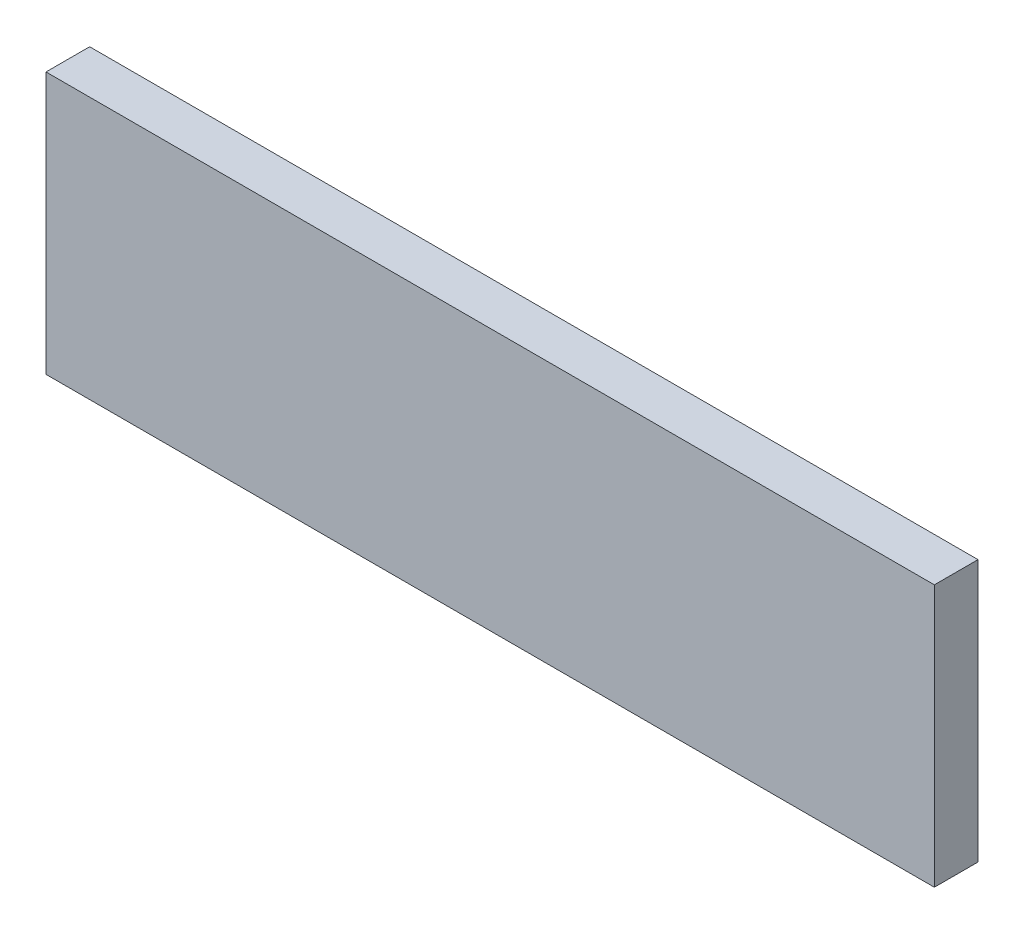
ISO-10303-21;
HEADER;
FILE_DESCRIPTION(('STEP AP214'),'2;1');
FILE_NAME('part.step','',(''),(''),'','','');
FILE_SCHEMA(('AUTOMOTIVE_DESIGN { 1 0 10303 214 1 1 1 1 }'));
ENDSEC;
DATA;
#1=APPLICATION_CONTEXT('core data for automotive mechanical design processes');
#2=APPLICATION_PROTOCOL_DEFINITION('international standard','automotive_design',2000,#1);
#3=PRODUCT_CONTEXT('',#1,'mechanical');
#4=PRODUCT('Part','Part','',(#3));
#5=PRODUCT_RELATED_PRODUCT_CATEGORY('part','',(#4));
#6=PRODUCT_DEFINITION_FORMATION('','',#4);
#7=PRODUCT_DEFINITION_CONTEXT('part definition',#1,'design');
#8=PRODUCT_DEFINITION('design','',#6,#7);
#9=PRODUCT_DEFINITION_SHAPE('','',#8);
#10=(LENGTH_UNIT() NAMED_UNIT(*) SI_UNIT(.MILLI.,.METRE.));
#11=(NAMED_UNIT(*) PLANE_ANGLE_UNIT() SI_UNIT($,.RADIAN.));
#12=(NAMED_UNIT(*) SI_UNIT($,.STERADIAN.) SOLID_ANGLE_UNIT());
#13=UNCERTAINTY_MEASURE_WITH_UNIT(LENGTH_MEASURE(1.E-05),#10,'distance_accuracy_value','');
#14=(GEOMETRIC_REPRESENTATION_CONTEXT(3) GLOBAL_UNCERTAINTY_ASSIGNED_CONTEXT((#13)) GLOBAL_UNIT_ASSIGNED_CONTEXT((#10,
#11,#12)) REPRESENTATION_CONTEXT('',''));
#15=CARTESIAN_POINT('',(0.,0.,0.));
#16=DIRECTION('',(0.,0.,1.));
#17=DIRECTION('',(1.,0.,0.));
#18=AXIS2_PLACEMENT_3D('',#15,#16,#17);
#19=CARTESIAN_POINT('',(203.5,-60.,20.));
#20=DIRECTION('',(-1.,0.,0.));
#21=DIRECTION('',(0.,0.,1.));
#22=AXIS2_PLACEMENT_3D('',#19,#20,#21);
#23=PLANE('',#22);
#24=DIRECTION('',(0.,1.,0.));
#25=VECTOR('',#24,1.);
#26=CARTESIAN_POINT('',(203.5,-60.,0.));
#27=LINE('',#26,#25);
#28=CARTESIAN_POINT('',(203.5,-60.,0.));
#29=VERTEX_POINT('',#28);
#30=CARTESIAN_POINT('',(203.5,60.,0.));
#31=VERTEX_POINT('',#30);
#32=EDGE_CURVE('E107',#29,#31,#27,.T.);
#33=ORIENTED_EDGE('',*,*,#32,.T.);
#34=DIRECTION('',(0.,0.,-1.));
#35=VECTOR('',#34,1.);
#36=CARTESIAN_POINT('',(203.5,60.,20.));
#37=LINE('',#36,#35);
#38=CARTESIAN_POINT('',(203.5,60.,20.));
#39=VERTEX_POINT('',#38);
#40=EDGE_CURVE('E11',#39,#31,#37,.T.);
#41=ORIENTED_EDGE('',*,*,#40,.F.);
#42=DIRECTION('',(0.,1.,0.));
#43=VECTOR('',#42,1.);
#44=CARTESIAN_POINT('',(203.5,-60.,20.));
#45=LINE('',#44,#43);
#46=CARTESIAN_POINT('',(203.5,-60.,20.));
#47=VERTEX_POINT('',#46);
#48=EDGE_CURVE('E91',#47,#39,#45,.T.);
#49=ORIENTED_EDGE('',*,*,#48,.F.);
#50=DIRECTION('',(0.,0.,-1.));
#51=VECTOR('',#50,1.);
#52=CARTESIAN_POINT('',(203.5,-60.,20.));
#53=LINE('',#52,#51);
#54=EDGE_CURVE('E103',#47,#29,#53,.T.);
#55=ORIENTED_EDGE('',*,*,#54,.T.);
#56=EDGE_LOOP('',(#33,#41,#49,#55));
#57=FACE_BOUND('',#56,.T.);
#58=ADVANCED_FACE('F39',(#57),#23,.F.);
#59=CARTESIAN_POINT('',(-203.5,60.,20.));
#60=DIRECTION('',(0.,-1.,0.));
#61=DIRECTION('',(0.,0.,-1.));
#62=AXIS2_PLACEMENT_3D('',#59,#60,#61);
#63=PLANE('',#62);
#64=DIRECTION('',(-1.,0.,0.));
#65=VECTOR('',#64,1.);
#66=CARTESIAN_POINT('',(-203.5,60.,0.));
#67=LINE('',#66,#65);
#68=CARTESIAN_POINT('',(-203.5,60.,0.));
#69=VERTEX_POINT('',#68);
#70=EDGE_CURVE('E96',#31,#69,#67,.T.);
#71=ORIENTED_EDGE('',*,*,#70,.T.);
#72=DIRECTION('',(0.,0.,-1.));
#73=VECTOR('',#72,1.);
#74=CARTESIAN_POINT('',(-203.5,60.,20.));
#75=LINE('',#74,#73);
#76=CARTESIAN_POINT('',(-203.5,60.,20.));
#77=VERTEX_POINT('',#76);
#78=EDGE_CURVE('E48',#77,#69,#75,.T.);
#79=ORIENTED_EDGE('',*,*,#78,.F.);
#80=DIRECTION('',(-1.,0.,0.));
#81=VECTOR('',#80,1.);
#82=CARTESIAN_POINT('',(-203.5,60.,20.));
#83=LINE('',#82,#81);
#84=EDGE_CURVE('E86',#39,#77,#83,.T.);
#85=ORIENTED_EDGE('',*,*,#84,.F.);
#86=ORIENTED_EDGE('',*,*,#40,.T.);
#87=EDGE_LOOP('',(#71,#79,#85,#86));
#88=FACE_BOUND('',#87,.T.);
#89=ADVANCED_FACE('F95',(#88),#63,.F.);
#90=CARTESIAN_POINT('',(-203.5,-60.,20.));
#91=DIRECTION('',(1.,0.,0.));
#92=DIRECTION('',(0.,0.,-1.));
#93=AXIS2_PLACEMENT_3D('',#90,#91,#92);
#94=PLANE('',#93);
#95=DIRECTION('',(0.,-1.,0.));
#96=VECTOR('',#95,1.);
#97=CARTESIAN_POINT('',(-203.5,-60.,0.));
#98=LINE('',#97,#96);
#99=CARTESIAN_POINT('',(-203.5,-60.,0.));
#100=VERTEX_POINT('',#99);
#101=EDGE_CURVE('E73',#69,#100,#98,.T.);
#102=ORIENTED_EDGE('',*,*,#101,.T.);
#103=DIRECTION('',(0.,0.,-1.));
#104=VECTOR('',#103,1.);
#105=CARTESIAN_POINT('',(-203.5,-60.,20.));
#106=LINE('',#105,#104);
#107=CARTESIAN_POINT('',(-203.5,-60.,20.));
#108=VERTEX_POINT('',#107);
#109=EDGE_CURVE('E98',#108,#100,#106,.T.);
#110=ORIENTED_EDGE('',*,*,#109,.F.);
#111=DIRECTION('',(0.,-1.,0.));
#112=VECTOR('',#111,1.);
#113=CARTESIAN_POINT('',(-203.5,-60.,20.));
#114=LINE('',#113,#112);
#115=EDGE_CURVE('E89',#77,#108,#114,.T.);
#116=ORIENTED_EDGE('',*,*,#115,.F.);
#117=ORIENTED_EDGE('',*,*,#78,.T.);
#118=EDGE_LOOP('',(#102,#110,#116,#117));
#119=FACE_BOUND('',#118,.T.);
#120=ADVANCED_FACE('F99',(#119),#94,.F.);
#121=CARTESIAN_POINT('',(-203.5,-60.,20.));
#122=DIRECTION('',(0.,1.,0.));
#123=DIRECTION('',(0.,0.,1.));
#124=AXIS2_PLACEMENT_3D('',#121,#122,#123);
#125=PLANE('',#124);
#126=DIRECTION('',(1.,0.,0.));
#127=VECTOR('',#126,1.);
#128=CARTESIAN_POINT('',(-203.5,-60.,0.));
#129=LINE('',#128,#127);
#130=EDGE_CURVE('E79',#100,#29,#129,.T.);
#131=ORIENTED_EDGE('',*,*,#130,.T.);
#132=ORIENTED_EDGE('',*,*,#54,.F.);
#133=DIRECTION('',(1.,0.,0.));
#134=VECTOR('',#133,1.);
#135=CARTESIAN_POINT('',(-203.5,-60.,20.));
#136=LINE('',#135,#134);
#137=EDGE_CURVE('E56',#108,#47,#136,.T.);
#138=ORIENTED_EDGE('',*,*,#137,.F.);
#139=ORIENTED_EDGE('',*,*,#109,.T.);
#140=EDGE_LOOP('',(#131,#132,#138,#139));
#141=FACE_BOUND('',#140,.T.);
#142=ADVANCED_FACE('F120',(#141),#125,.F.);
#143=CARTESIAN_POINT('',(0.,0.,20.));
#144=DIRECTION('',(0.,0.,-1.));
#145=DIRECTION('',(-1.,0.,0.));
#146=AXIS2_PLACEMENT_3D('',#143,#144,#145);
#147=PLANE('',#146);
#148=ORIENTED_EDGE('',*,*,#48,.T.);
#149=ORIENTED_EDGE('',*,*,#84,.T.);
#150=ORIENTED_EDGE('',*,*,#115,.T.);
#151=ORIENTED_EDGE('',*,*,#137,.T.);
#152=EDGE_LOOP('',(#148,#149,#150,#151));
#153=FACE_BOUND('',#152,.T.);
#154=ADVANCED_FACE('F87',(#153),#147,.F.);
#155=CARTESIAN_POINT('',(0.,0.,0.));
#156=DIRECTION('',(0.,0.,-1.));
#157=DIRECTION('',(-1.,0.,0.));
#158=AXIS2_PLACEMENT_3D('',#155,#156,#157);
#159=PLANE('',#158);
#160=ORIENTED_EDGE('',*,*,#32,.F.);
#161=ORIENTED_EDGE('',*,*,#130,.F.);
#162=ORIENTED_EDGE('',*,*,#101,.F.);
#163=ORIENTED_EDGE('',*,*,#70,.F.);
#164=EDGE_LOOP('',(#160,#161,#162,#163));
#165=FACE_BOUND('',#164,.T.);
#166=ADVANCED_FACE('F123',(#165),#159,.T.);
#167=CLOSED_SHELL('',(#58,#89,#120,#142,#154,#166));
#168=MANIFOLD_SOLID_BREP('B2',#167);
#169=ADVANCED_BREP_SHAPE_REPRESENTATION('',(#18,#168),#14);
#170=SHAPE_DEFINITION_REPRESENTATION(#9,#169);
ENDSEC;
END-ISO-10303-21;
